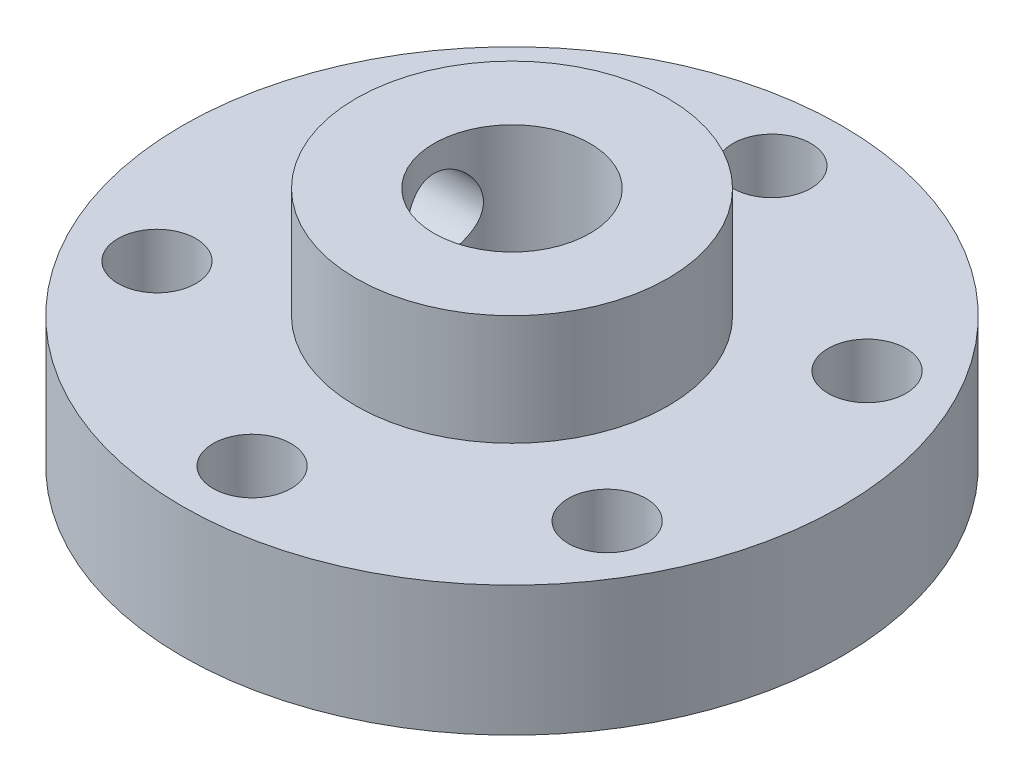
ISO-10303-21;
HEADER;
FILE_DESCRIPTION(('STEP AP214'),'2;1');
FILE_NAME('part.step','',(''),(''),'','','');
FILE_SCHEMA(('AUTOMOTIVE_DESIGN { 1 0 10303 214 1 1 1 1 }'));
ENDSEC;
DATA;
#1=APPLICATION_CONTEXT('core data for automotive mechanical design processes');
#2=APPLICATION_PROTOCOL_DEFINITION('international standard','automotive_design',2000,#1);
#3=PRODUCT_CONTEXT('',#1,'mechanical');
#4=PRODUCT('Part','Part','',(#3));
#5=PRODUCT_RELATED_PRODUCT_CATEGORY('part','',(#4));
#6=PRODUCT_DEFINITION_FORMATION('','',#4);
#7=PRODUCT_DEFINITION_CONTEXT('part definition',#1,'design');
#8=PRODUCT_DEFINITION('design','',#6,#7);
#9=PRODUCT_DEFINITION_SHAPE('','',#8);
#10=(LENGTH_UNIT() NAMED_UNIT(*) SI_UNIT(.MILLI.,.METRE.));
#11=(NAMED_UNIT(*) PLANE_ANGLE_UNIT() SI_UNIT($,.RADIAN.));
#12=(NAMED_UNIT(*) SI_UNIT($,.STERADIAN.) SOLID_ANGLE_UNIT());
#13=UNCERTAINTY_MEASURE_WITH_UNIT(LENGTH_MEASURE(1.E-05),#10,'distance_accuracy_value','');
#14=(GEOMETRIC_REPRESENTATION_CONTEXT(3) GLOBAL_UNCERTAINTY_ASSIGNED_CONTEXT((#13)) GLOBAL_UNIT_ASSIGNED_CONTEXT((#10,
#11,#12)) REPRESENTATION_CONTEXT('',''));
#15=CARTESIAN_POINT('',(0.,0.,0.));
#16=DIRECTION('',(0.,0.,1.));
#17=DIRECTION('',(1.,0.,0.));
#18=AXIS2_PLACEMENT_3D('',#15,#16,#17);
#19=CARTESIAN_POINT('',(0.,5.,0.));
#20=DIRECTION('',(0.,1.,0.));
#21=DIRECTION('',(0.,0.,1.));
#22=AXIS2_PLACEMENT_3D('',#19,#20,#21);
#23=PLANE('',#22);
#24=CARTESIAN_POINT('',(0.,5.,-10.));
#25=DIRECTION('',(0.,1.,0.));
#26=DIRECTION('',(0.,0.,1.));
#27=AXIS2_PLACEMENT_3D('',#24,#25,#26);
#28=CIRCLE('',#27,1.5);
#29=CARTESIAN_POINT('',(0.,5.,-8.5));
#30=VERTEX_POINT('',#29);
#31=EDGE_CURVE('E159',#30,#30,#28,.F.);
#32=ORIENTED_EDGE('',*,*,#31,.T.);
#33=EDGE_LOOP('',(#32));
#34=FACE_BOUND('',#33,.T.);
#35=CARTESIAN_POINT('',(-8.66025403784425,5.,-4.99999999999975));
#36=DIRECTION('',(0.,1.,0.));
#37=DIRECTION('',(0.,0.,1.));
#38=AXIS2_PLACEMENT_3D('',#35,#36,#37);
#39=CIRCLE('',#38,1.50000000000033);
#40=CARTESIAN_POINT('',(-8.66025403784425,5.,-3.49999999999942));
#41=VERTEX_POINT('',#40);
#42=EDGE_CURVE('E163',#41,#41,#39,.F.);
#43=ORIENTED_EDGE('',*,*,#42,.T.);
#44=EDGE_LOOP('',(#43));
#45=FACE_BOUND('',#44,.T.);
#46=CARTESIAN_POINT('',(-8.66025403784396,5.,5.00000000000025));
#47=DIRECTION('',(0.,1.,0.));
#48=DIRECTION('',(0.,0.,1.));
#49=AXIS2_PLACEMENT_3D('',#46,#47,#48);
#50=CIRCLE('',#49,1.50000000000057);
#51=CARTESIAN_POINT('',(-8.66025403784396,5.,6.50000000000081));
#52=VERTEX_POINT('',#51);
#53=EDGE_CURVE('E167',#52,#52,#50,.F.);
#54=ORIENTED_EDGE('',*,*,#53,.T.);
#55=EDGE_LOOP('',(#54));
#56=FACE_BOUND('',#55,.T.);
#57=CARTESIAN_POINT('',(5.64760248210638E-13,5.,10.));
#58=DIRECTION('',(0.,1.,0.));
#59=DIRECTION('',(0.,0.,1.));
#60=AXIS2_PLACEMENT_3D('',#57,#58,#59);
#61=CIRCLE('',#60,1.50000000000061);
#62=CARTESIAN_POINT('',(5.64760248210638E-13,5.,11.5000000000006));
#63=VERTEX_POINT('',#62);
#64=EDGE_CURVE('E171',#63,#63,#61,.F.);
#65=ORIENTED_EDGE('',*,*,#64,.T.);
#66=EDGE_LOOP('',(#65));
#67=FACE_BOUND('',#66,.T.);
#68=CARTESIAN_POINT('',(8.66025403784481,5.,4.99999999999975));
#69=DIRECTION('',(0.,1.,0.));
#70=DIRECTION('',(0.,0.,1.));
#71=AXIS2_PLACEMENT_3D('',#68,#69,#70);
#72=CIRCLE('',#71,1.50000000000038);
#73=CARTESIAN_POINT('',(8.66025403784481,5.,6.50000000000013));
#74=VERTEX_POINT('',#73);
#75=EDGE_CURVE('E175',#74,#74,#72,.F.);
#76=ORIENTED_EDGE('',*,*,#75,.T.);
#77=EDGE_LOOP('',(#76));
#78=FACE_BOUND('',#77,.T.);
#79=CARTESIAN_POINT('',(8.66025403784453,5.,-5.00000000000025));
#80=DIRECTION('',(0.,1.,0.));
#81=DIRECTION('',(0.,0.,1.));
#82=AXIS2_PLACEMENT_3D('',#79,#80,#81);
#83=CIRCLE('',#82,1.50000000000009);
#84=CARTESIAN_POINT('',(8.66025403784453,5.,-3.50000000000016));
#85=VERTEX_POINT('',#84);
#86=EDGE_CURVE('E179',#85,#85,#83,.F.);
#87=ORIENTED_EDGE('',*,*,#86,.T.);
#88=EDGE_LOOP('',(#87));
#89=FACE_BOUND('',#88,.T.);
#90=CARTESIAN_POINT('',(0.,5.,0.));
#91=DIRECTION('',(0.,1.,0.));
#92=DIRECTION('',(0.,0.,1.));
#93=AXIS2_PLACEMENT_3D('',#90,#91,#92);
#94=CIRCLE('',#93,12.685);
#95=CARTESIAN_POINT('',(0.,5.,12.685));
#96=VERTEX_POINT('',#95);
#97=EDGE_CURVE('E10',#96,#96,#94,.T.);
#98=ORIENTED_EDGE('',*,*,#97,.T.);
#99=EDGE_LOOP('',(#98));
#100=FACE_BOUND('',#99,.T.);
#101=CARTESIAN_POINT('',(0.,5.,0.));
#102=DIRECTION('',(0.,1.,0.));
#103=DIRECTION('',(0.,0.,1.));
#104=AXIS2_PLACEMENT_3D('',#101,#102,#103);
#105=CIRCLE('',#104,6.);
#106=CARTESIAN_POINT('',(0.,5.,6.));
#107=VERTEX_POINT('',#106);
#108=EDGE_CURVE('E145',#107,#107,#105,.F.);
#109=ORIENTED_EDGE('',*,*,#108,.T.);
#110=EDGE_LOOP('',(#109));
#111=FACE_BOUND('',#110,.T.);
#112=ADVANCED_FACE('F40',(#34,#45,#56,#67,#78,#89,#100,#111),#23,.T.);
#113=CARTESIAN_POINT('',(0.,0.,0.));
#114=DIRECTION('',(0.,1.,0.));
#115=DIRECTION('',(0.,0.,1.));
#116=AXIS2_PLACEMENT_3D('',#113,#114,#115);
#117=PLANE('',#116);
#118=CARTESIAN_POINT('',(0.,0.,-10.));
#119=DIRECTION('',(0.,1.,0.));
#120=DIRECTION('',(0.,0.,1.));
#121=AXIS2_PLACEMENT_3D('',#118,#119,#120);
#122=CIRCLE('',#121,1.5);
#123=CARTESIAN_POINT('',(0.,0.,-8.5));
#124=VERTEX_POINT('',#123);
#125=EDGE_CURVE('E117',#124,#124,#122,.T.);
#126=ORIENTED_EDGE('',*,*,#125,.T.);
#127=EDGE_LOOP('',(#126));
#128=FACE_BOUND('',#127,.T.);
#129=CARTESIAN_POINT('',(-8.66025403784425,0.,-4.99999999999975));
#130=DIRECTION('',(0.,1.,0.));
#131=DIRECTION('',(0.,0.,1.));
#132=AXIS2_PLACEMENT_3D('',#129,#130,#131);
#133=CIRCLE('',#132,1.50000000000033);
#134=CARTESIAN_POINT('',(-8.66025403784425,0.,-3.49999999999942));
#135=VERTEX_POINT('',#134);
#136=EDGE_CURVE('E121',#135,#135,#133,.T.);
#137=ORIENTED_EDGE('',*,*,#136,.T.);
#138=EDGE_LOOP('',(#137));
#139=FACE_BOUND('',#138,.T.);
#140=CARTESIAN_POINT('',(-8.66025403784396,0.,5.00000000000025));
#141=DIRECTION('',(0.,1.,0.));
#142=DIRECTION('',(0.,0.,1.));
#143=AXIS2_PLACEMENT_3D('',#140,#141,#142);
#144=CIRCLE('',#143,1.50000000000057);
#145=CARTESIAN_POINT('',(-8.66025403784396,0.,6.50000000000081));
#146=VERTEX_POINT('',#145);
#147=EDGE_CURVE('E125',#146,#146,#144,.T.);
#148=ORIENTED_EDGE('',*,*,#147,.T.);
#149=EDGE_LOOP('',(#148));
#150=FACE_BOUND('',#149,.T.);
#151=CARTESIAN_POINT('',(5.64760248210638E-13,0.,10.));
#152=DIRECTION('',(0.,1.,0.));
#153=DIRECTION('',(0.,0.,1.));
#154=AXIS2_PLACEMENT_3D('',#151,#152,#153);
#155=CIRCLE('',#154,1.50000000000061);
#156=CARTESIAN_POINT('',(5.64760248210638E-13,0.,11.5000000000006));
#157=VERTEX_POINT('',#156);
#158=EDGE_CURVE('E129',#157,#157,#155,.T.);
#159=ORIENTED_EDGE('',*,*,#158,.T.);
#160=EDGE_LOOP('',(#159));
#161=FACE_BOUND('',#160,.T.);
#162=CARTESIAN_POINT('',(8.66025403784481,0.,4.99999999999975));
#163=DIRECTION('',(0.,1.,0.));
#164=DIRECTION('',(0.,0.,1.));
#165=AXIS2_PLACEMENT_3D('',#162,#163,#164);
#166=CIRCLE('',#165,1.50000000000038);
#167=CARTESIAN_POINT('',(8.66025403784481,0.,6.50000000000013));
#168=VERTEX_POINT('',#167);
#169=EDGE_CURVE('E133',#168,#168,#166,.T.);
#170=ORIENTED_EDGE('',*,*,#169,.T.);
#171=EDGE_LOOP('',(#170));
#172=FACE_BOUND('',#171,.T.);
#173=CARTESIAN_POINT('',(8.66025403784453,0.,-5.00000000000025));
#174=DIRECTION('',(0.,1.,0.));
#175=DIRECTION('',(0.,0.,1.));
#176=AXIS2_PLACEMENT_3D('',#173,#174,#175);
#177=CIRCLE('',#176,1.50000000000009);
#178=CARTESIAN_POINT('',(8.66025403784453,0.,-3.50000000000016));
#179=VERTEX_POINT('',#178);
#180=EDGE_CURVE('E137',#179,#179,#177,.T.);
#181=ORIENTED_EDGE('',*,*,#180,.T.);
#182=EDGE_LOOP('',(#181));
#183=FACE_BOUND('',#182,.T.);
#184=CARTESIAN_POINT('',(0.,0.,0.));
#185=DIRECTION('',(0.,1.,0.));
#186=DIRECTION('',(0.,0.,1.));
#187=AXIS2_PLACEMENT_3D('',#184,#185,#186);
#188=CIRCLE('',#187,3.);
#189=CARTESIAN_POINT('',(0.,0.,3.));
#190=VERTEX_POINT('',#189);
#191=EDGE_CURVE('E61',#190,#190,#188,.T.);
#192=ORIENTED_EDGE('',*,*,#191,.T.);
#193=EDGE_LOOP('',(#192));
#194=FACE_BOUND('',#193,.T.);
#195=CARTESIAN_POINT('',(0.,0.,0.));
#196=DIRECTION('',(0.,1.,0.));
#197=DIRECTION('',(0.,0.,1.));
#198=AXIS2_PLACEMENT_3D('',#195,#196,#197);
#199=CIRCLE('',#198,12.685);
#200=CARTESIAN_POINT('',(0.,0.,12.685));
#201=VERTEX_POINT('',#200);
#202=EDGE_CURVE('E55',#201,#201,#199,.T.);
#203=ORIENTED_EDGE('',*,*,#202,.F.);
#204=EDGE_LOOP('',(#203));
#205=FACE_BOUND('',#204,.T.);
#206=ADVANCED_FACE('F106',(#128,#139,#150,#161,#172,#183,#194,#205),#117,.F.);
#207=CARTESIAN_POINT('',(0.,5.,0.));
#208=DIRECTION('',(0.,-1.,0.));
#209=DIRECTION('',(0.,0.,-1.));
#210=AXIS2_PLACEMENT_3D('',#207,#208,#209);
#211=CYLINDRICAL_SURFACE('',#210,12.685);
#212=CARTESIAN_POINT('',(-12.685,1.,0.));
#213=CARTESIAN_POINT('',(-12.6849988816288,1.00000358773883,-0.0839413442146256));
#214=CARTESIAN_POINT('',(-12.6841579781139,1.00706989694314,-0.167936031903327));
#215=CARTESIAN_POINT('',(-12.6808843250432,1.03514866700585,-0.333590637114948));
#216=CARTESIAN_POINT('',(-12.6784498866339,1.0561759242356,-0.415247981546581));
#217=CARTESIAN_POINT('',(-12.6722635775755,1.11155058086949,-0.573805533903206));
#218=CARTESIAN_POINT('',(-12.6685125674238,1.14588928158296,-0.650708810517154));
#219=CARTESIAN_POINT('',(-12.6601109548527,1.22689364791473,-0.797645588154126));
#220=CARTESIAN_POINT('',(-12.6554605139157,1.27355710131576,-0.867680318948276));
#221=CARTESIAN_POINT('',(-12.6457540154276,1.3781335826655,-0.999253929904067));
#222=CARTESIAN_POINT('',(-12.6406962575583,1.43609537291419,-1.06075393154504));
#223=CARTESIAN_POINT('',(-12.6307589757555,1.56151864989211,-1.17317766955124));
#224=CARTESIAN_POINT('',(-12.625879460661,1.62898060693041,-1.22410088199974));
#225=CARTESIAN_POINT('',(-12.6168342675962,1.77173944172434,-1.31406847762132));
#226=CARTESIAN_POINT('',(-12.6126707751461,1.84705921801558,-1.35307676447085));
#227=CARTESIAN_POINT('',(-12.6055511461914,2.00323783551792,-1.41787670589418));
#228=CARTESIAN_POINT('',(-12.6025949686,2.08409648812335,-1.44366881024222));
#229=CARTESIAN_POINT('',(-12.5982407187147,2.24865578901439,-1.48118685008723));
#230=CARTESIAN_POINT('',(-12.5968354088068,2.33234134123487,-1.49297814454845));
#231=CARTESIAN_POINT('',(-12.5957197853754,2.50051441871813,-1.5023620369758));
#232=CARTESIAN_POINT('',(-12.5960094106033,2.58500191489153,-1.49995514801091));
#233=CARTESIAN_POINT('',(-12.5982443119804,2.75192654676529,-1.48106470950215));
#234=CARTESIAN_POINT('',(-12.6001811419613,2.83437193806815,-1.4646529694525));
#235=CARTESIAN_POINT('',(-12.605479045113,2.99533009010719,-1.41833064903308));
#236=CARTESIAN_POINT('',(-12.6088401443584,3.07384277881664,-1.38841982153037));
#237=CARTESIAN_POINT('',(-12.6166174988895,3.22493102008878,-1.31587059622497));
#238=CARTESIAN_POINT('',(-12.6210363515381,3.29749135806522,-1.27320080289224));
#239=CARTESIAN_POINT('',(-12.6304292645903,3.43444852468633,-1.17636737182438));
#240=CARTESIAN_POINT('',(-12.6354033477252,3.49884501886924,-1.12220326342546));
#241=CARTESIAN_POINT('',(-12.6453838491018,3.61806346393356,-1.00351984637682));
#242=CARTESIAN_POINT('',(-12.6503902771869,3.6728237792323,-0.938938606158241));
#243=CARTESIAN_POINT('',(-12.6598425378113,3.77073615381914,-0.801467913476254));
#244=CARTESIAN_POINT('',(-12.6642883692782,3.81388819090281,-0.728578445121163));
#245=CARTESIAN_POINT('',(-12.6721208690308,3.88735839074271,-0.576514235684874));
#246=CARTESIAN_POINT('',(-12.6755072363744,3.91767290784976,-0.497337716752774));
#247=CARTESIAN_POINT('',(-12.6808364456321,3.9645597195925,-0.334969366819791));
#248=CARTESIAN_POINT('',(-12.6827793479872,3.98113258962383,-0.251777704096954));
#249=CARTESIAN_POINT('',(-12.6849948880651,3.99998627376211,-0.0842737441892528));
#250=CARTESIAN_POINT('',(-12.6852774532003,4.00235203623299,2.88654456138623E-05));
#251=CARTESIAN_POINT('',(-12.6841672317112,3.99294821929649,0.167829346249262));
#252=CARTESIAN_POINT('',(-12.6827744769385,3.98117890862885,0.25132723268723));
#253=CARTESIAN_POINT('',(-12.6784763326718,3.94390957783979,0.414899008124883));
#254=CARTESIAN_POINT('',(-12.6755753827628,3.91844984988751,0.494982204141111));
#255=CARTESIAN_POINT('',(-12.6685858106762,3.85456414164858,0.649741955986335));
#256=CARTESIAN_POINT('',(-12.6644971520711,3.81613776366321,0.724418345898425));
#257=CARTESIAN_POINT('',(-12.6555636652614,3.72720251424501,0.866625456641735));
#258=CARTESIAN_POINT('',(-12.6507154185077,3.67663844082564,0.934121436194908));
#259=CARTESIAN_POINT('',(-12.6408163810546,3.56494152966507,1.05969882549573));
#260=CARTESIAN_POINT('',(-12.6357655831928,3.50380831793549,1.11777990195659));
#261=CARTESIAN_POINT('',(-12.626000286134,3.37233529598261,1.22317830300307));
#262=CARTESIAN_POINT('',(-12.6212876247113,3.30195031526342,1.27043947716036));
#263=CARTESIAN_POINT('',(-12.6127617992295,3.1541919587684,1.35246915216556));
#264=CARTESIAN_POINT('',(-12.6089486187591,3.07681871053208,1.38723788094948));
#265=CARTESIAN_POINT('',(-12.6026657550157,2.91746464745236,1.44320389479353));
#266=CARTESIAN_POINT('',(-12.6001928895181,2.83549526054738,1.46443334667644));
#267=CARTESIAN_POINT('',(-12.5968613186149,2.66912415399217,1.4928220103266));
#268=CARTESIAN_POINT('',(-12.5960025466115,2.58472253484246,1.49998180261266));
#269=CARTESIAN_POINT('',(-12.5959981895918,2.41644125655581,1.50001801640343));
#270=CARTESIAN_POINT('',(-12.596842024718,2.33256160292784,1.49298264546237));
#271=CARTESIAN_POINT('',(-12.6001251129237,2.16718553720429,1.46501449385253));
#272=CARTESIAN_POINT('',(-12.6025643667066,2.08568912615938,1.44408170705708));
#273=CARTESIAN_POINT('',(-12.6087602774829,1.92740139887262,1.38893959334626));
#274=CARTESIAN_POINT('',(-12.6125165597623,1.85060875163356,1.35473404243163));
#275=CARTESIAN_POINT('',(-12.6209239523904,1.70383942641321,1.27402610829629));
#276=CARTESIAN_POINT('',(-12.6255750692712,1.63386279819273,1.22752363531029));
#277=CARTESIAN_POINT('',(-12.6352827165827,1.50226050981919,1.12321325518673));
#278=CARTESIAN_POINT('',(-12.6403414998443,1.44068715387152,1.06533956478186));
#279=CARTESIAN_POINT('',(-12.6502743589852,1.32809109051493,0.940065500845709));
#280=CARTESIAN_POINT('',(-12.6551483908458,1.27707088475113,0.872662874821669));
#281=CARTESIAN_POINT('',(-12.6641807288358,1.18688354435987,0.729982738540818));
#282=CARTESIAN_POINT('',(-12.6683365318266,1.14775751707562,0.65467910090045));
#283=CARTESIAN_POINT('',(-12.6754384028409,1.08276095968464,0.498565070014075));
#284=CARTESIAN_POINT('',(-12.6783857991452,1.05687586734359,0.417760837605672));
#285=CARTESIAN_POINT('',(-12.6820194321819,1.02536789955103,0.280438856534757));
#286=CARTESIAN_POINT('',(-12.6831317684495,1.01586841005174,0.224790768354749));
#287=CARTESIAN_POINT('',(-12.6846224257239,1.00318327508562,0.112769810087538));
#288=CARTESIAN_POINT('',(-12.6850007513904,0.999997589536956,0.0563969446037165));
#289=CARTESIAN_POINT('',(-12.685,1.,0.));
#290=B_SPLINE_CURVE_WITH_KNOTS('',3,(#212,#213,#214,#215,#216,#217,#218,#219,#220,#221,#222,
#223,#224,#225,#226,#227,#228,#229,#230,#231,#232,#233,#234,#235,#236,#237,#238,#239,#240,#241,
#242,#243,#244,#245,#246,#247,#248,#249,#250,#251,#252,#253,#254,#255,#256,#257,#258,#259,#260,
#261,#262,#263,#264,#265,#266,#267,#268,#269,#270,#271,#272,#273,#274,#275,#276,#277,#278,#279,
#280,#281,#282,#283,#284,#285,#286,#287,#288,#289),.UNSPECIFIED.,.T.,.F.,(4,2,2,2,2,2,2,2,2,2,2,
2,2,2,2,2,2,2,2,2,2,2,2,2,2,2,2,2,2,2,2,2,2,2,2,2,2,2,4),(0.,0.251618050250071,
0.503503201974703,0.755224029861737,1.00689970607862,1.25968664658597,1.51248610580112,
1.76604399507216,2.01959325466674,2.27195417599885,2.52430597801172,2.77537157464221,
3.02644176781271,3.27813491683023,3.5298383740497,3.78309749087322,4.03635709212993,
4.28968856688759,4.54300943351474,4.79481410190352,5.04661398299134,5.29767681752594,
5.5487473530819,5.80098213910014,6.05322585225976,6.30675033486327,6.56027019144767,
6.8131854655471,7.06609030405968,7.31742845320468,7.56876671315214,7.82003352163341,
8.07130216436753,8.32406964716962,8.57689698050624,8.83058842568256,9.0840002606746,
9.25305377608067,9.42210621828323),.UNSPECIFIED.);
#291=CARTESIAN_POINT('',(-12.685,1.,0.));
#292=VERTEX_POINT('',#291);
#293=EDGE_CURVE('E93',#292,#292,#290,.T.);
#294=ORIENTED_EDGE('',*,*,#293,.T.);
#295=EDGE_LOOP('',(#294));
#296=FACE_BOUND('',#295,.T.);
#297=ORIENTED_EDGE('',*,*,#97,.F.);
#298=EDGE_LOOP('',(#297));
#299=FACE_BOUND('',#298,.T.);
#300=ORIENTED_EDGE('',*,*,#202,.T.);
#301=EDGE_LOOP('',(#300));
#302=FACE_BOUND('',#301,.T.);
#303=ADVANCED_FACE('F42',(#296,#299,#302),#211,.T.);
#304=CARTESIAN_POINT('',(0.,5.,0.));
#305=DIRECTION('',(0.,-1.,0.));
#306=DIRECTION('',(0.,0.,-1.));
#307=AXIS2_PLACEMENT_3D('',#304,#305,#306);
#308=CYLINDRICAL_SURFACE('',#307,3.);
#309=CARTESIAN_POINT('',(-2.59807621135332,6.75,-1.5));
#310=CARTESIAN_POINT('',(-2.59808302092689,6.82816171229288,-1.4999945446118));
#311=CARTESIAN_POINT('',(-2.60165701781635,6.90642211728757,-1.49384995609983));
#312=CARTESIAN_POINT('',(-2.61543549678079,7.06054089701573,-1.46958481484708));
#313=CARTESIAN_POINT('',(-2.62565391083339,7.13639387256511,-1.45143909683127));
#314=CARTESIAN_POINT('',(-2.65124019908098,7.28317749651591,-1.40414992304972));
#315=CARTESIAN_POINT('',(-2.66658065209878,7.35413197871038,-1.3750649287406));
#316=CARTESIAN_POINT('',(-2.70063997225287,7.49013630299508,-1.30690128806456));
#317=CARTESIAN_POINT('',(-2.71935902214097,7.55518582539369,-1.26782210105366));
#318=CARTESIAN_POINT('',(-2.75995303586162,7.68345859283626,-1.17699981079632));
#319=CARTESIAN_POINT('',(-2.7819609545693,7.74608870351032,-1.12447805421566));
#320=CARTESIAN_POINT('',(-2.82557974178559,7.86211258261007,-1.0098807114217));
#321=CARTESIAN_POINT('',(-2.84719040746875,7.91550174387528,-0.94780038867344));
#322=CARTESIAN_POINT('',(-2.88932215429424,8.0150507267215,-0.81073434512182));
#323=CARTESIAN_POINT('',(-2.90967159627259,8.0604806517893,-0.735160783518862));
#324=CARTESIAN_POINT('',(-2.94526134149294,8.13771127986865,-0.576235539899256));
#325=CARTESIAN_POINT('',(-2.96050486775612,8.16952058420576,-0.492888807207233));
#326=CARTESIAN_POINT('',(-2.98320691866356,8.21625699195165,-0.327067415888966));
#327=CARTESIAN_POINT('',(-2.99114220331338,8.2322242895333,-0.244952685733226));
#328=CARTESIAN_POINT('',(-3.00011375769101,8.25024917801256,-0.0788559430467723));
#329=CARTESIAN_POINT('',(-3.00115420176885,8.25231518519357,0.00512490876560759));
#330=CARTESIAN_POINT('',(-2.99644472874675,8.24287998904448,0.164748786635625));
#331=CARTESIAN_POINT('',(-2.99127743838241,8.23254297671817,0.240481798765187));
#332=CARTESIAN_POINT('',(-2.97561367889621,8.20067873414302,0.388970657877483));
#333=CARTESIAN_POINT('',(-2.96511681099591,8.17915066653567,0.461726281640888));
#334=CARTESIAN_POINT('',(-2.93957374931482,8.12537615086528,0.60346408735433));
#335=CARTESIAN_POINT('',(-2.92446662293799,8.0929855302419,0.672380135272767));
#336=CARTESIAN_POINT('',(-2.89106468980031,8.01860487569776,0.803965202269993));
#337=CARTESIAN_POINT('',(-2.87276874236226,7.97661140504648,0.866631973257968));
#338=CARTESIAN_POINT('',(-2.83266591598844,7.87965697270048,0.990260491347292));
#339=CARTESIAN_POINT('',(-2.81069063997263,7.82384545751099,1.05050111254404));
#340=CARTESIAN_POINT('',(-2.76681510880218,7.70311541260474,1.16115655544667));
#341=CARTESIAN_POINT('',(-2.74491492398443,7.63818994158891,1.21156381736135));
#342=CARTESIAN_POINT('',(-2.70216234138727,7.49602771136387,1.30425800196332));
#343=CARTESIAN_POINT('',(-2.68146479986061,7.41827096541869,1.34582597246708));
#344=CARTESIAN_POINT('',(-2.64563175417864,7.2555934929615,1.41497866950185));
#345=CARTESIAN_POINT('',(-2.63049045069101,7.17068035047366,1.44257798731634));
#346=CARTESIAN_POINT('',(-2.60916953725552,7.00317823307582,1.48077031653756));
#347=CARTESIAN_POINT('',(-2.60237483772745,6.92093832143467,1.49253768317996));
#348=CARTESIAN_POINT('',(-2.59676879042414,6.75539798772519,1.50227541991714));
#349=CARTESIAN_POINT('',(-2.59795180333967,6.67209835632032,1.50025553597254));
#350=CARTESIAN_POINT('',(-2.60751504810877,6.51651912213191,1.48355406501595));
#351=CARTESIAN_POINT('',(-2.61509381259981,6.44403082333811,1.4702817250687));
#352=CARTESIAN_POINT('',(-2.63541032327012,6.30244832059356,1.43354442694866));
#353=CARTESIAN_POINT('',(-2.64814974007551,6.23335522388009,1.41007616793542));
#354=CARTESIAN_POINT('',(-2.67804333119485,6.09688300364596,1.35247138290733));
#355=CARTESIAN_POINT('',(-2.69537464864595,6.02973147471967,1.31789109553909));
#356=CARTESIAN_POINT('',(-2.73234179245875,5.90179609269151,1.23943059602371));
#357=CARTESIAN_POINT('',(-2.75197880032721,5.84101553473008,1.19554560649833));
#358=CARTESIAN_POINT('',(-2.79431997684504,5.71953184871468,1.09325575079828));
#359=CARTESIAN_POINT('',(-2.81709874731433,5.65980427392351,1.03371790847245));
#360=CARTESIAN_POINT('',(-2.86101352466839,5.55088164300961,0.905106743097433));
#361=CARTESIAN_POINT('',(-2.88214897511564,5.50169014465419,0.836030211983021));
#362=CARTESIAN_POINT('',(-2.92112042536435,5.41413941107485,0.687803043838136));
#363=CARTESIAN_POINT('',(-2.93885462508044,5.37610032268364,0.60843464636117));
#364=CARTESIAN_POINT('',(-2.96825032438952,5.31429314421391,0.443283546961623));
#365=CARTESIAN_POINT('',(-2.9799171551456,5.29051252295054,0.357506552088264));
#366=CARTESIAN_POINT('',(-2.99501262272824,5.25994715373801,0.190469523495626));
#367=CARTESIAN_POINT('',(-2.99909891862287,5.25180318618583,0.109517165775686));
#368=CARTESIAN_POINT('',(-3.00063195562697,5.2487351018184,-0.0526889789268047));
#369=CARTESIAN_POINT('',(-2.99808102100335,5.25380635721465,-0.133942650442629));
#370=CARTESIAN_POINT('',(-2.98700953256884,5.27612461019344,-0.28880698847572));
#371=CARTESIAN_POINT('',(-2.97889342001985,5.29254727388651,-0.362568476716895));
#372=CARTESIAN_POINT('',(-2.95788140495135,5.33599049895446,-0.506168928275426));
#373=CARTESIAN_POINT('',(-2.94498481699194,5.36301258014018,-0.576007327433263));
#374=CARTESIAN_POINT('',(-2.9148889612218,5.42809057824896,-0.713135109367327));
#375=CARTESIAN_POINT('',(-2.89752925798199,5.46656898481176,-0.780187714050069));
#376=CARTESIAN_POINT('',(-2.86032199712739,5.55293689628857,-0.907161962721037));
#377=CARTESIAN_POINT('',(-2.84047329837541,5.60083072367351,-0.96708031112236));
#378=CARTESIAN_POINT('',(-2.79792915339941,5.71019570853405,-1.08437100623534));
#379=CARTESIAN_POINT('',(-2.77514698517547,5.77254373121579,-1.14089652680891));
#380=CARTESIAN_POINT('',(-2.73094614244278,5.90617608169465,-1.24299493109201));
#381=CARTESIAN_POINT('',(-2.70952868642798,5.97746823130153,-1.28855812501509));
#382=CARTESIAN_POINT('',(-2.66999407957374,6.12995496987143,-1.36864661967848));
#383=CARTESIAN_POINT('',(-2.65200261384405,6.2113912966931,-1.40277759894141));
#384=CARTESIAN_POINT('',(-2.62299234492527,6.37999860650967,-1.45631806425962));
#385=CARTESIAN_POINT('',(-2.61195024221553,6.46714933336903,-1.47577678676302));
#386=CARTESIAN_POINT('',(-2.60293908902686,6.58770803347799,-1.49155051179662));
#387=CARTESIAN_POINT('',(-2.60112193507728,6.62005184159682,-1.49471415744578));
#388=CARTESIAN_POINT('',(-2.59868903831625,6.68492472102337,-1.49894010763495));
#389=CARTESIAN_POINT('',(-2.59807337587664,6.71745380457881,-1.50000227159981));
#390=CARTESIAN_POINT('',(-2.59807621135332,6.75,-1.5));
#391=B_SPLINE_CURVE_WITH_KNOTS('',3,(#309,#310,#311,#312,#313,#314,#315,#316,#317,#318,#319,
#320,#321,#322,#323,#324,#325,#326,#327,#328,#329,#330,#331,#332,#333,#334,#335,#336,#337,#338,
#339,#340,#341,#342,#343,#344,#345,#346,#347,#348,#349,#350,#351,#352,#353,#354,#355,#356,#357,
#358,#359,#360,#361,#362,#363,#364,#365,#366,#367,#368,#369,#370,#371,#372,#373,#374,#375,#376,
#377,#378,#379,#380,#381,#382,#383,#384,#385,#386,#387,#388,#389,#390),.UNSPECIFIED.,.T.,.F.,(4,
2,2,2,2,2,2,2,2,2,2,2,2,2,2,2,2,2,2,2,2,2,2,2,2,2,2,2,2,2,2,2,2,2,2,2,2,2,2,2,4),(0.,
0.234348183892073,0.469189339237207,0.702792893878328,0.936409088167724,1.18929346874735,
1.44230356626557,1.71236838358145,1.98226240445837,2.23295227451903,2.4834903552906,
2.71224146226808,2.94100968776183,3.1729430209672,3.40495949025408,3.65890787185336,
3.91305072368878,4.18333262594173,4.45333161317558,4.70193436281318,4.9503613978256,
5.17161275136039,5.39293578654095,5.62450944609132,5.85620229330071,6.1171011537092,
6.37808797467304,6.64596272119449,6.91360169713158,7.15668405584231,7.39968130190958,
7.62666637307239,7.8536840026802,8.09041126079208,8.32724745151079,8.58765362775102,
8.84828914267732,9.11716123557908,9.38512699504141,9.48270202777964,9.58028358741811),.UNSPECIFIED.);
#392=CARTESIAN_POINT('',(-2.59807621135332,6.75,-1.5));
#393=VERTEX_POINT('',#392);
#394=EDGE_CURVE('E73',#393,#393,#391,.T.);
#395=ORIENTED_EDGE('',*,*,#394,.F.);
#396=EDGE_LOOP('',(#395));
#397=FACE_BOUND('',#396,.T.);
#398=CARTESIAN_POINT('',(-2.59807621135332,2.5,-1.5));
#399=CARTESIAN_POINT('',(-2.59808302092689,2.57816171229288,-1.4999945446118));
#400=CARTESIAN_POINT('',(-2.60165701781635,2.65642211728757,-1.49384995609983));
#401=CARTESIAN_POINT('',(-2.61543549678079,2.81054089701573,-1.46958481484708));
#402=CARTESIAN_POINT('',(-2.62565391083339,2.88639387256511,-1.45143909683127));
#403=CARTESIAN_POINT('',(-2.65124019908098,3.03317749651591,-1.40414992304972));
#404=CARTESIAN_POINT('',(-2.66658065209878,3.10413197871038,-1.3750649287406));
#405=CARTESIAN_POINT('',(-2.70063997225287,3.24013630299508,-1.30690128806456));
#406=CARTESIAN_POINT('',(-2.71935902214097,3.30518582539369,-1.26782210105366));
#407=CARTESIAN_POINT('',(-2.75995303586162,3.43345859283626,-1.17699981079632));
#408=CARTESIAN_POINT('',(-2.7819609545693,3.49608870351032,-1.12447805421566));
#409=CARTESIAN_POINT('',(-2.82557974178559,3.61211258261006,-1.0098807114217));
#410=CARTESIAN_POINT('',(-2.84719040746875,3.66550174387528,-0.94780038867344));
#411=CARTESIAN_POINT('',(-2.88932215429424,3.76505072672149,-0.810734345121819));
#412=CARTESIAN_POINT('',(-2.90967159627259,3.8104806517893,-0.735160783518862));
#413=CARTESIAN_POINT('',(-2.94526134149294,3.88771127986864,-0.576235539899256));
#414=CARTESIAN_POINT('',(-2.96050486775612,3.91952058420576,-0.492888807207233));
#415=CARTESIAN_POINT('',(-2.98320691866356,3.96625699195165,-0.327067415888966));
#416=CARTESIAN_POINT('',(-2.99114220331338,3.9822242895333,-0.244952685733226));
#417=CARTESIAN_POINT('',(-3.00011375769101,4.00024917801256,-0.0788559430467723));
#418=CARTESIAN_POINT('',(-3.00115420176885,4.00231518519357,0.00512490876560759));
#419=CARTESIAN_POINT('',(-2.99644472874675,3.99287998904448,0.164748786635625));
#420=CARTESIAN_POINT('',(-2.99127743838241,3.98254297671817,0.240481798765187));
#421=CARTESIAN_POINT('',(-2.97561367889621,3.95067873414301,0.388970657877483));
#422=CARTESIAN_POINT('',(-2.96511681099591,3.92915066653567,0.461726281640888));
#423=CARTESIAN_POINT('',(-2.93957374931482,3.87537615086528,0.60346408735433));
#424=CARTESIAN_POINT('',(-2.92446662293799,3.8429855302419,0.672380135272768));
#425=CARTESIAN_POINT('',(-2.89106468980031,3.76860487569776,0.803965202269993));
#426=CARTESIAN_POINT('',(-2.87276874236226,3.72661140504648,0.866631973257969));
#427=CARTESIAN_POINT('',(-2.83266591598844,3.62965697270048,0.990260491347292));
#428=CARTESIAN_POINT('',(-2.81069063997263,3.57384545751098,1.05050111254404));
#429=CARTESIAN_POINT('',(-2.76681510880218,3.45311541260473,1.16115655544667));
#430=CARTESIAN_POINT('',(-2.74491492398443,3.38818994158891,1.21156381736135));
#431=CARTESIAN_POINT('',(-2.70216234138727,3.24602771136387,1.30425800196332));
#432=CARTESIAN_POINT('',(-2.68146479986061,3.16827096541868,1.34582597246708));
#433=CARTESIAN_POINT('',(-2.64563175417864,3.0055934929615,1.41497866950185));
#434=CARTESIAN_POINT('',(-2.63049045069101,2.92068035047366,1.44257798731633));
#435=CARTESIAN_POINT('',(-2.60916953725552,2.75317823307581,1.48077031653756));
#436=CARTESIAN_POINT('',(-2.60237483772745,2.67093832143467,1.49253768317996));
#437=CARTESIAN_POINT('',(-2.59676879042414,2.50539798772519,1.50227541991714));
#438=CARTESIAN_POINT('',(-2.59795180333967,2.42209835632032,1.50025553597254));
#439=CARTESIAN_POINT('',(-2.60751504810877,2.26651912213191,1.48355406501595));
#440=CARTESIAN_POINT('',(-2.61509381259981,2.19403082333811,1.4702817250687));
#441=CARTESIAN_POINT('',(-2.63541032327012,2.05244832059356,1.43354442694866));
#442=CARTESIAN_POINT('',(-2.64814974007551,1.98335522388009,1.41007616793542));
#443=CARTESIAN_POINT('',(-2.67804333119485,1.84688300364596,1.35247138290733));
#444=CARTESIAN_POINT('',(-2.69537464864595,1.77973147471967,1.31789109553909));
#445=CARTESIAN_POINT('',(-2.73234179245875,1.65179609269151,1.23943059602371));
#446=CARTESIAN_POINT('',(-2.75197880032721,1.59101553473007,1.19554560649832));
#447=CARTESIAN_POINT('',(-2.79431997684504,1.46953184871468,1.09325575079828));
#448=CARTESIAN_POINT('',(-2.81709874731434,1.40980427392351,1.03371790847245));
#449=CARTESIAN_POINT('',(-2.86101352466839,1.30088164300961,0.905106743097433));
#450=CARTESIAN_POINT('',(-2.88214897511564,1.25169014465419,0.83603021198302));
#451=CARTESIAN_POINT('',(-2.92112042536435,1.16413941107485,0.687803043838136));
#452=CARTESIAN_POINT('',(-2.93885462508044,1.12610032268363,0.60843464636117));
#453=CARTESIAN_POINT('',(-2.96825032438952,1.06429314421391,0.443283546961623));
#454=CARTESIAN_POINT('',(-2.9799171551456,1.04051252295054,0.357506552088264));
#455=CARTESIAN_POINT('',(-2.99501262272824,1.00994715373801,0.190469523495625));
#456=CARTESIAN_POINT('',(-2.99909891862287,1.00180318618583,0.109517165775685));
#457=CARTESIAN_POINT('',(-3.00063195562697,0.998735101818398,-0.0526889789268058));
#458=CARTESIAN_POINT('',(-2.99808102100335,1.00380635721465,-0.133942650442631));
#459=CARTESIAN_POINT('',(-2.98700953256884,1.02612461019344,-0.288806988475721));
#460=CARTESIAN_POINT('',(-2.97889342001985,1.04254727388651,-0.362568476716896));
#461=CARTESIAN_POINT('',(-2.95788140495135,1.08599049895446,-0.506168928275427));
#462=CARTESIAN_POINT('',(-2.94498481699194,1.11301258014018,-0.576007327433263));
#463=CARTESIAN_POINT('',(-2.9148889612218,1.17809057824896,-0.713135109367327));
#464=CARTESIAN_POINT('',(-2.89752925798199,1.21656898481176,-0.78018771405007));
#465=CARTESIAN_POINT('',(-2.86032199712739,1.30293689628858,-0.907161962721037));
#466=CARTESIAN_POINT('',(-2.84047329837541,1.35083072367351,-0.967080311122361));
#467=CARTESIAN_POINT('',(-2.79792915339941,1.46019570853405,-1.08437100623534));
#468=CARTESIAN_POINT('',(-2.77514698517547,1.52254373121579,-1.14089652680891));
#469=CARTESIAN_POINT('',(-2.73094614244278,1.65617608169466,-1.24299493109201));
#470=CARTESIAN_POINT('',(-2.70952868642798,1.72746823130153,-1.28855812501509));
#471=CARTESIAN_POINT('',(-2.66999407957374,1.87995496987143,-1.36864661967848));
#472=CARTESIAN_POINT('',(-2.65200261384405,1.9613912966931,-1.40277759894141));
#473=CARTESIAN_POINT('',(-2.62299234492527,2.12999860650967,-1.45631806425962));
#474=CARTESIAN_POINT('',(-2.61195024221553,2.21714933336903,-1.47577678676302));
#475=CARTESIAN_POINT('',(-2.60293908902686,2.33770803347799,-1.49155051179662));
#476=CARTESIAN_POINT('',(-2.60112193507728,2.37005184159682,-1.49471415744578));
#477=CARTESIAN_POINT('',(-2.59868903831625,2.43492472102337,-1.49894010763494));
#478=CARTESIAN_POINT('',(-2.59807337587664,2.46745380457881,-1.50000227159981));
#479=CARTESIAN_POINT('',(-2.59807621135332,2.5,-1.5));
#480=B_SPLINE_CURVE_WITH_KNOTS('',3,(#398,#399,#400,#401,#402,#403,#404,#405,#406,#407,#408,
#409,#410,#411,#412,#413,#414,#415,#416,#417,#418,#419,#420,#421,#422,#423,#424,#425,#426,#427,
#428,#429,#430,#431,#432,#433,#434,#435,#436,#437,#438,#439,#440,#441,#442,#443,#444,#445,#446,
#447,#448,#449,#450,#451,#452,#453,#454,#455,#456,#457,#458,#459,#460,#461,#462,#463,#464,#465,
#466,#467,#468,#469,#470,#471,#472,#473,#474,#475,#476,#477,#478,#479),.UNSPECIFIED.,.T.,.F.,(4,
2,2,2,2,2,2,2,2,2,2,2,2,2,2,2,2,2,2,2,2,2,2,2,2,2,2,2,2,2,2,2,2,2,2,2,2,2,2,2,4),(0.,
0.234348183892073,0.469189339237207,0.702792893878329,0.936409088167724,1.18929346874735,
1.44230356626557,1.71236838358145,1.98226240445837,2.23295227451903,2.4834903552906,
2.71224146226808,2.94100968776183,3.1729430209672,3.40495949025408,3.65890787185336,
3.91305072368878,4.18333262594173,4.45333161317557,4.70193436281318,4.9503613978256,
5.17161275136038,5.39293578654095,5.62450944609131,5.85620229330071,6.1171011537092,
6.37808797467303,6.64596272119449,6.91360169713157,7.1566840558423,7.39968130190958,
7.62666637307239,7.8536840026802,8.09041126079208,8.32724745151079,8.58765362775101,
8.84828914267732,9.11716123557908,9.38512699504141,9.48270202777964,9.58028358741811),.UNSPECIFIED.);
#481=CARTESIAN_POINT('',(-2.59807621135332,2.5,-1.5));
#482=VERTEX_POINT('',#481);
#483=EDGE_CURVE('E45',#482,#482,#480,.T.);
#484=ORIENTED_EDGE('',*,*,#483,.F.);
#485=EDGE_LOOP('',(#484));
#486=FACE_BOUND('',#485,.T.);
#487=ORIENTED_EDGE('',*,*,#191,.F.);
#488=EDGE_LOOP('',(#487));
#489=FACE_BOUND('',#488,.T.);
#490=CARTESIAN_POINT('',(0.,9.25,0.));
#491=DIRECTION('',(0.,1.,0.));
#492=DIRECTION('',(0.,0.,1.));
#493=AXIS2_PLACEMENT_3D('',#490,#491,#492);
#494=CIRCLE('',#493,3.);
#495=CARTESIAN_POINT('',(0.,9.25,3.));
#496=VERTEX_POINT('',#495);
#497=EDGE_CURVE('E153',#496,#496,#494,.T.);
#498=ORIENTED_EDGE('',*,*,#497,.T.);
#499=EDGE_LOOP('',(#498));
#500=FACE_BOUND('',#499,.T.);
#501=ADVANCED_FACE('F98',(#397,#486,#489,#500),#308,.F.);
#502=CARTESIAN_POINT('',(0.,9.25,0.));
#503=DIRECTION('',(0.,1.,0.));
#504=DIRECTION('',(0.,0.,1.));
#505=AXIS2_PLACEMENT_3D('',#502,#503,#504);
#506=PLANE('',#505);
#507=CARTESIAN_POINT('',(0.,9.25,0.));
#508=DIRECTION('',(0.,1.,0.));
#509=DIRECTION('',(0.,0.,1.));
#510=AXIS2_PLACEMENT_3D('',#507,#508,#509);
#511=CIRCLE('',#510,6.);
#512=CARTESIAN_POINT('',(0.,9.25,6.));
#513=VERTEX_POINT('',#512);
#514=EDGE_CURVE('E148',#513,#513,#511,.T.);
#515=ORIENTED_EDGE('',*,*,#514,.T.);
#516=EDGE_LOOP('',(#515));
#517=FACE_BOUND('',#516,.T.);
#518=ORIENTED_EDGE('',*,*,#497,.F.);
#519=EDGE_LOOP('',(#518));
#520=FACE_BOUND('',#519,.T.);
#521=ADVANCED_FACE('F102',(#517,#520),#506,.T.);
#522=CARTESIAN_POINT('',(0.,9.25,0.));
#523=DIRECTION('',(0.,-1.,0.));
#524=DIRECTION('',(0.,0.,-1.));
#525=AXIS2_PLACEMENT_3D('',#522,#523,#524);
#526=CYLINDRICAL_SURFACE('',#525,6.);
#527=CARTESIAN_POINT('',(-5.80947501931113,6.75,-1.5));
#528=CARTESIAN_POINT('',(-5.80947660051185,6.83283045055477,-1.49999764715507));
#529=CARTESIAN_POINT('',(-5.81126583608348,6.9156869392068,-1.49311574729838));
#530=CARTESIAN_POINT('',(-5.81821117195949,7.07902054690442,-1.46581387527849));
#531=CARTESIAN_POINT('',(-5.82336923173088,7.159496252681,-1.44538602404532));
#532=CARTESIAN_POINT('',(-5.8364323475758,7.31568212291223,-1.39169471977917));
#533=CARTESIAN_POINT('',(-5.84433385614245,7.3913982932314,-1.35844783671268));
#534=CARTESIAN_POINT('',(-5.86198915217285,7.53618651152395,-1.28011268475685));
#535=CARTESIAN_POINT('',(-5.87174301827101,7.60525827724814,-1.23502391313642));
#536=CARTESIAN_POINT('',(-5.89224429813367,7.73631698715732,-1.13322505638713));
#537=CARTESIAN_POINT('',(-5.90300758573818,7.79813616021003,-1.07630213262243));
#538=CARTESIAN_POINT('',(-5.92417725309178,7.91145683661621,-0.9529092384604));
#539=CARTESIAN_POINT('',(-5.93458359939834,7.96295737537305,-0.886438376508185));
#540=CARTESIAN_POINT('',(-5.95404249312349,8.05486528057877,-0.744687120647373));
#541=CARTESIAN_POINT('',(-5.96307412440355,8.09510783289688,-0.669296745717073));
#542=CARTESIAN_POINT('',(-5.9785848715559,8.16228578649185,-0.512557910575658));
#543=CARTESIAN_POINT('',(-5.98506436400607,8.18922315114931,-0.431210331475164));
#544=CARTESIAN_POINT('',(-5.99462855308908,8.22848870074715,-0.266615255252497));
#545=CARTESIAN_POINT('',(-5.99777936306589,8.24110178659595,-0.183439631729385));
#546=CARTESIAN_POINT('',(-6.00056156464379,8.25225502756533,-0.0160972915576613));
#547=CARTESIAN_POINT('',(-6.00019347658022,8.25079726332576,0.0680692767228414));
#548=CARTESIAN_POINT('',(-5.99602856972121,8.23405508984991,0.233028370758581));
#549=CARTESIAN_POINT('',(-5.99230801404524,8.21907820496769,0.313854323401601));
#550=CARTESIAN_POINT('',(-5.98194501914912,8.1762172379709,0.47180737112053));
#551=CARTESIAN_POINT('',(-5.97530242439065,8.14833246877356,0.548934269055658));
#552=CARTESIAN_POINT('',(-5.95972505820537,8.08019845758776,0.698110055252711));
#553=CARTESIAN_POINT('',(-5.95077011817032,8.03983977320295,0.770106764649758));
#554=CARTESIAN_POINT('',(-5.9315394228579,7.94798659253025,0.906413433510734));
#555=CARTESIAN_POINT('',(-5.92126343791494,7.89649015886363,0.970722052628259));
#556=CARTESIAN_POINT('',(-5.90018228261712,7.78217475481057,1.09166105262744));
#557=CARTESIAN_POINT('',(-5.88937031715551,7.71908706459134,1.1480365186128));
#558=CARTESIAN_POINT('',(-5.86869026110024,7.58424001587585,1.24946456394453));
#559=CARTESIAN_POINT('',(-5.85882221463582,7.5124802523054,1.29451661406903));
#560=CARTESIAN_POINT('',(-5.84112298098989,7.36182597951062,1.3721821935339));
#561=CARTESIAN_POINT('',(-5.83330190235432,7.28289856181208,1.40473435045574));
#562=CARTESIAN_POINT('',(-5.82071184083974,7.12044871915413,1.45602843095451));
#563=CARTESIAN_POINT('',(-5.81594220486131,7.03692728161012,1.47477330982937));
#564=CARTESIAN_POINT('',(-5.81013213623485,6.87002429908613,1.49749778319911));
#565=CARTESIAN_POINT('',(-5.80899653456189,6.78669732400222,1.50185428435178));
#566=CARTESIAN_POINT('',(-5.81032406088624,6.6205068380531,1.49671019430933));
#567=CARTESIAN_POINT('',(-5.8127868576076,6.53764328522926,1.48721087870928));
#568=CARTESIAN_POINT('',(-5.82094249172736,6.37613144102718,1.4549552783626));
#569=CARTESIAN_POINT('',(-5.82658182140625,6.29743636405749,1.43241844096905));
#570=CARTESIAN_POINT('',(-5.84040430962577,6.14494112528899,1.37497084900237));
#571=CARTESIAN_POINT('',(-5.84858776949168,6.0711415445668,1.34005862862753));
#572=CARTESIAN_POINT('',(-5.86677682255957,5.92893523327959,1.25806240076193));
#573=CARTESIAN_POINT('',(-5.87681501163985,5.86066269597414,1.21075305230138));
#574=CARTESIAN_POINT('',(-5.8975024984303,5.73288698231919,1.10559043940168));
#575=CARTESIAN_POINT('',(-5.90815189637082,5.67338525000996,1.04773544220816));
#576=CARTESIAN_POINT('',(-5.92918441818964,5.56331337445743,0.921394081477089));
#577=CARTESIAN_POINT('',(-5.93955421237102,5.51300396247071,0.852677928797389));
#578=CARTESIAN_POINT('',(-5.95858329968241,5.42463847982925,0.707554024042014));
#579=CARTESIAN_POINT('',(-5.96724268202376,5.38658177003508,0.631146673436387));
#580=CARTESIAN_POINT('',(-5.98182069442989,5.32413237928324,0.473337302596636));
#581=CARTESIAN_POINT('',(-5.98775898013446,5.29964142937256,0.391976071541822));
#582=CARTESIAN_POINT('',(-5.99631176037473,5.26472379923495,0.226124640478212));
#583=CARTESIAN_POINT('',(-5.99892689636045,5.25429440475657,0.141635047561866));
#584=CARTESIAN_POINT('',(-6.00051254113217,5.2479486156367,-0.0256252896649894));
#585=CARTESIAN_POINT('',(-5.99957968320012,5.25164743635691,-0.10838074044905));
#586=CARTESIAN_POINT('',(-5.99438844686135,5.2725717409415,-0.27205124462211));
#587=CARTESIAN_POINT('',(-5.99013016735643,5.28979682251965,-0.35296635267133));
#588=CARTESIAN_POINT('',(-5.97878149280944,5.33707832965639,-0.510256553467224));
#589=CARTESIAN_POINT('',(-5.97170646753999,5.36706517997194,-0.586653741871528));
#590=CARTESIAN_POINT('',(-5.95546933370076,5.43895586852899,-0.733375579562203));
#591=CARTESIAN_POINT('',(-5.94630696206604,5.48086120900435,-0.803699461897577));
#592=CARTESIAN_POINT('',(-5.92660874521999,5.57657285099561,-0.938102892635849));
#593=CARTESIAN_POINT('',(-5.91604525418417,5.63064021436107,-1.00199248245088));
#594=CARTESIAN_POINT('',(-5.89485973579863,5.7486342779607,-1.11992253040688));
#595=CARTESIAN_POINT('',(-5.88423769428834,5.81256347414686,-1.17396048760228));
#596=CARTESIAN_POINT('',(-5.86391213790822,5.949902121302,-1.27164303971884));
#597=CARTESIAN_POINT('',(-5.85422945594827,6.02346618511894,-1.31507492916982));
#598=CARTESIAN_POINT('',(-5.83715933325924,6.17708323488405,-1.3888903449235));
#599=CARTESIAN_POINT('',(-5.82977022370054,6.25713144916011,-1.41928336463958));
#600=CARTESIAN_POINT('',(-5.81927863109675,6.40586551774008,-1.46163379284816));
#601=CARTESIAN_POINT('',(-5.8156299450082,6.47383974657579,-1.47598975589307));
#602=CARTESIAN_POINT('',(-5.81072757878358,6.61120330349995,-1.4951734388599));
#603=CARTESIAN_POINT('',(-5.80947369434945,6.68059251036759,-1.50000197155828));
#604=CARTESIAN_POINT('',(-5.80947501931113,6.75,-1.5));
#605=B_SPLINE_CURVE_WITH_KNOTS('',3,(#527,#528,#529,#530,#531,#532,#533,#534,#535,#536,#537,
#538,#539,#540,#541,#542,#543,#544,#545,#546,#547,#548,#549,#550,#551,#552,#553,#554,#555,#556,
#557,#558,#559,#560,#561,#562,#563,#564,#565,#566,#567,#568,#569,#570,#571,#572,#573,#574,#575,
#576,#577,#578,#579,#580,#581,#582,#583,#584,#585,#586,#587,#588,#589,#590,#591,#592,#593,#594,
#595,#596,#597,#598,#599,#600,#601,#602,#603,#604),.UNSPECIFIED.,.T.,.F.,(4,2,2,2,2,2,2,2,2,2,2,
2,2,2,2,2,2,2,2,2,2,2,2,2,2,2,2,2,2,2,2,2,2,2,2,2,2,2,4),(0.,0.248236465041681,0.4966174448572,
0.744678436299613,0.99274996053287,1.24574372515786,1.4987611288792,1.75530897838752,
2.01181895908255,2.26313250597208,2.51440889199612,2.76010957613368,3.00582334034872,
3.25375724552667,3.50173431281348,3.75642279943147,4.01112318719881,4.26705859205042,
4.52293920077729,4.7720614485703,5.02116076310281,5.26618443005524,5.51123712852851,
5.76109707515495,6.01099811331027,6.26715198579191,6.52329249431732,6.77755243684158,
7.03176329345423,7.27910067676474,7.52643070426189,7.77242925935827,8.01845883442843,
8.27038257949243,8.52237018939305,8.77905886370806,9.03556032819972,9.24358696306398,
9.45159585059712),.UNSPECIFIED.);
#606=CARTESIAN_POINT('',(-5.80947501931113,6.75,-1.5));
#607=VERTEX_POINT('',#606);
#608=EDGE_CURVE('E65',#607,#607,#605,.T.);
#609=ORIENTED_EDGE('',*,*,#608,.T.);
#610=EDGE_LOOP('',(#609));
#611=FACE_BOUND('',#610,.T.);
#612=ORIENTED_EDGE('',*,*,#108,.F.);
#613=EDGE_LOOP('',(#612));
#614=FACE_BOUND('',#613,.T.);
#615=ORIENTED_EDGE('',*,*,#514,.F.);
#616=EDGE_LOOP('',(#615));
#617=FACE_BOUND('',#616,.T.);
#618=ADVANCED_FACE('F74',(#611,#614,#617),#526,.T.);
#619=CARTESIAN_POINT('',(8.66025403784453,12.,-5.00000000000025));
#620=DIRECTION('',(0.,-1.,0.));
#621=DIRECTION('',(0.,0.,-1.));
#622=AXIS2_PLACEMENT_3D('',#619,#620,#621);
#623=CYLINDRICAL_SURFACE('',#622,1.50000000000009);
#624=ORIENTED_EDGE('',*,*,#86,.F.);
#625=EDGE_LOOP('',(#624));
#626=FACE_BOUND('',#625,.T.);
#627=ORIENTED_EDGE('',*,*,#180,.F.);
#628=EDGE_LOOP('',(#627));
#629=FACE_BOUND('',#628,.T.);
#630=ADVANCED_FACE('F209',(#626,#629),#623,.F.);
#631=CARTESIAN_POINT('',(8.66025403784481,12.,4.99999999999975));
#632=DIRECTION('',(0.,-1.,0.));
#633=DIRECTION('',(0.,0.,-1.));
#634=AXIS2_PLACEMENT_3D('',#631,#632,#633);
#635=CYLINDRICAL_SURFACE('',#634,1.50000000000038);
#636=ORIENTED_EDGE('',*,*,#75,.F.);
#637=EDGE_LOOP('',(#636));
#638=FACE_BOUND('',#637,.T.);
#639=ORIENTED_EDGE('',*,*,#169,.F.);
#640=EDGE_LOOP('',(#639));
#641=FACE_BOUND('',#640,.T.);
#642=ADVANCED_FACE('F220',(#638,#641),#635,.F.);
#643=CARTESIAN_POINT('',(5.64760248210638E-13,12.,10.));
#644=DIRECTION('',(0.,-1.,0.));
#645=DIRECTION('',(0.,0.,-1.));
#646=AXIS2_PLACEMENT_3D('',#643,#644,#645);
#647=CYLINDRICAL_SURFACE('',#646,1.50000000000061);
#648=ORIENTED_EDGE('',*,*,#64,.F.);
#649=EDGE_LOOP('',(#648));
#650=FACE_BOUND('',#649,.T.);
#651=ORIENTED_EDGE('',*,*,#158,.F.);
#652=EDGE_LOOP('',(#651));
#653=FACE_BOUND('',#652,.T.);
#654=ADVANCED_FACE('F216',(#650,#653),#647,.F.);
#655=CARTESIAN_POINT('',(-8.66025403784396,12.,5.00000000000025));
#656=DIRECTION('',(0.,-1.,0.));
#657=DIRECTION('',(0.,0.,-1.));
#658=AXIS2_PLACEMENT_3D('',#655,#656,#657);
#659=CYLINDRICAL_SURFACE('',#658,1.50000000000057);
#660=ORIENTED_EDGE('',*,*,#53,.F.);
#661=EDGE_LOOP('',(#660));
#662=FACE_BOUND('',#661,.T.);
#663=ORIENTED_EDGE('',*,*,#147,.F.);
#664=EDGE_LOOP('',(#663));
#665=FACE_BOUND('',#664,.T.);
#666=ADVANCED_FACE('F212',(#662,#665),#659,.F.);
#667=CARTESIAN_POINT('',(-8.66025403784425,12.,-4.99999999999975));
#668=DIRECTION('',(0.,-1.,0.));
#669=DIRECTION('',(0.,0.,-1.));
#670=AXIS2_PLACEMENT_3D('',#667,#668,#669);
#671=CYLINDRICAL_SURFACE('',#670,1.50000000000033);
#672=ORIENTED_EDGE('',*,*,#42,.F.);
#673=EDGE_LOOP('',(#672));
#674=FACE_BOUND('',#673,.T.);
#675=ORIENTED_EDGE('',*,*,#136,.F.);
#676=EDGE_LOOP('',(#675));
#677=FACE_BOUND('',#676,.T.);
#678=ADVANCED_FACE('F215',(#674,#677),#671,.F.);
#679=CARTESIAN_POINT('',(0.,12.,-10.));
#680=DIRECTION('',(0.,-1.,0.));
#681=DIRECTION('',(0.,0.,-1.));
#682=AXIS2_PLACEMENT_3D('',#679,#680,#681);
#683=CYLINDRICAL_SURFACE('',#682,1.5);
#684=ORIENTED_EDGE('',*,*,#31,.F.);
#685=EDGE_LOOP('',(#684));
#686=FACE_BOUND('',#685,.T.);
#687=ORIENTED_EDGE('',*,*,#125,.F.);
#688=EDGE_LOOP('',(#687));
#689=FACE_BOUND('',#688,.T.);
#690=ADVANCED_FACE('F81',(#686,#689),#683,.F.);
#691=CARTESIAN_POINT('',(-12.685,6.75,0.));
#692=DIRECTION('',(1.,0.,0.));
#693=DIRECTION('',(0.,0.,-1.));
#694=AXIS2_PLACEMENT_3D('',#691,#692,#693);
#695=CYLINDRICAL_SURFACE('',#694,1.5);
#696=ORIENTED_EDGE('',*,*,#394,.T.);
#697=EDGE_LOOP('',(#696));
#698=FACE_BOUND('',#697,.T.);
#699=ORIENTED_EDGE('',*,*,#608,.F.);
#700=EDGE_LOOP('',(#699));
#701=FACE_BOUND('',#700,.T.);
#702=ADVANCED_FACE('F77',(#698,#701),#695,.F.);
#703=CARTESIAN_POINT('',(-12.685,2.5,0.));
#704=DIRECTION('',(1.,0.,0.));
#705=DIRECTION('',(0.,0.,-1.));
#706=AXIS2_PLACEMENT_3D('',#703,#704,#705);
#707=CYLINDRICAL_SURFACE('',#706,1.5);
#708=ORIENTED_EDGE('',*,*,#483,.T.);
#709=EDGE_LOOP('',(#708));
#710=FACE_BOUND('',#709,.T.);
#711=ORIENTED_EDGE('',*,*,#293,.F.);
#712=EDGE_LOOP('',(#711));
#713=FACE_BOUND('',#712,.T.);
#714=ADVANCED_FACE('F80',(#710,#713),#707,.F.);
#715=CLOSED_SHELL('',(#112,#206,#303,#501,#521,#618,#630,#642,#654,#666,#678,#690,#702,#714));
#716=MANIFOLD_SOLID_BREP('B2',#715);
#717=ADVANCED_BREP_SHAPE_REPRESENTATION('',(#18,#716),#14);
#718=SHAPE_DEFINITION_REPRESENTATION(#9,#717);
ENDSEC;
END-ISO-10303-21;
